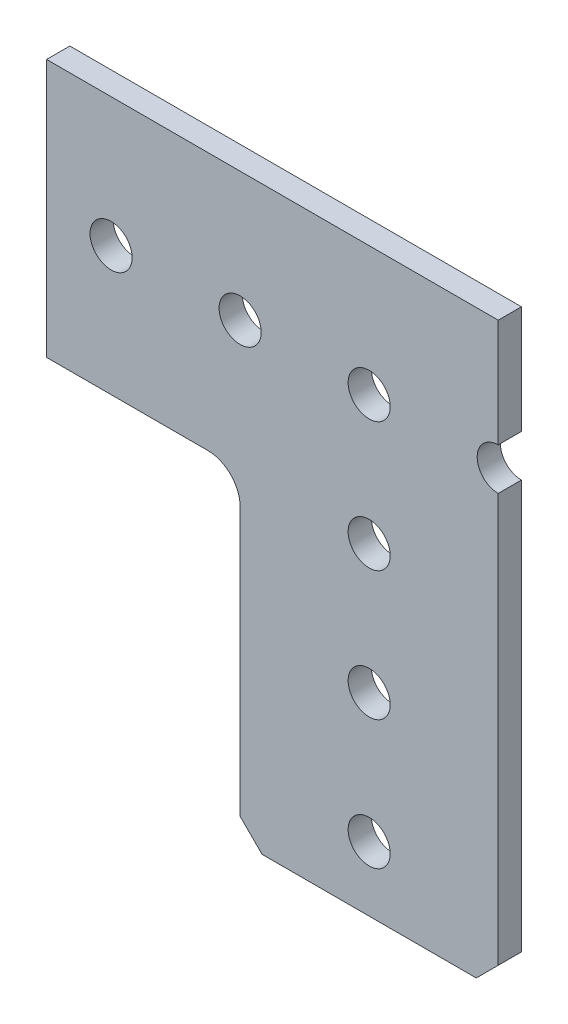
ISO-10303-21;
HEADER;
FILE_DESCRIPTION(('STEP AP214'),'2;1');
FILE_NAME('part.step','',(''),(''),'','','');
FILE_SCHEMA(('AUTOMOTIVE_DESIGN { 1 0 10303 214 1 1 1 1 }'));
ENDSEC;
DATA;
#1=APPLICATION_CONTEXT('core data for automotive mechanical design processes');
#2=APPLICATION_PROTOCOL_DEFINITION('international standard','automotive_design',2000,#1);
#3=PRODUCT_CONTEXT('',#1,'mechanical');
#4=PRODUCT('Part','Part','',(#3));
#5=PRODUCT_RELATED_PRODUCT_CATEGORY('part','',(#4));
#6=PRODUCT_DEFINITION_FORMATION('','',#4);
#7=PRODUCT_DEFINITION_CONTEXT('part definition',#1,'design');
#8=PRODUCT_DEFINITION('design','',#6,#7);
#9=PRODUCT_DEFINITION_SHAPE('','',#8);
#10=(LENGTH_UNIT() NAMED_UNIT(*) SI_UNIT(.MILLI.,.METRE.));
#11=(NAMED_UNIT(*) PLANE_ANGLE_UNIT() SI_UNIT($,.RADIAN.));
#12=(NAMED_UNIT(*) SI_UNIT($,.STERADIAN.) SOLID_ANGLE_UNIT());
#13=UNCERTAINTY_MEASURE_WITH_UNIT(LENGTH_MEASURE(1.E-05),#10,'distance_accuracy_value','');
#14=(GEOMETRIC_REPRESENTATION_CONTEXT(3) GLOBAL_UNCERTAINTY_ASSIGNED_CONTEXT((#13)) GLOBAL_UNIT_ASSIGNED_CONTEXT((#10,
#11,#12)) REPRESENTATION_CONTEXT('',''));
#15=CARTESIAN_POINT('',(0.,0.,0.));
#16=DIRECTION('',(0.,0.,1.));
#17=DIRECTION('',(1.,0.,0.));
#18=AXIS2_PLACEMENT_3D('',#15,#16,#17);
#19=CARTESIAN_POINT('',(-44.45,0.,0.));
#20=DIRECTION('',(0.,0.,1.));
#21=DIRECTION('',(1.,0.,0.));
#22=AXIS2_PLACEMENT_3D('',#19,#20,#21);
#23=PLANE('',#22);
#24=CARTESIAN_POINT('',(0.,-12.7,0.));
#25=DIRECTION('',(0.,0.,-1.));
#26=DIRECTION('',(-1.,0.,0.));
#27=AXIS2_PLACEMENT_3D('',#24,#25,#26);
#28=CIRCLE('',#27,2.0701);
#29=CARTESIAN_POINT('',(-2.0701,-12.7,0.));
#30=VERTEX_POINT('',#29);
#31=EDGE_CURVE('E131',#30,#30,#28,.F.);
#32=ORIENTED_EDGE('',*,*,#31,.T.);
#33=EDGE_LOOP('',(#32));
#34=FACE_BOUND('',#33,.T.);
#35=DIRECTION('',(0.,1.,0.));
#36=VECTOR('',#35,1.);
#37=CARTESIAN_POINT('',(-31.75,25.4,0.));
#38=LINE('',#37,#36);
#39=CARTESIAN_POINT('',(-31.75,0.,0.));
#40=VERTEX_POINT('',#39);
#41=CARTESIAN_POINT('',(-31.75,25.4,0.));
#42=VERTEX_POINT('',#41);
#43=EDGE_CURVE('E112',#40,#42,#38,.T.);
#44=ORIENTED_EDGE('',*,*,#43,.T.);
#45=DIRECTION('',(1.,0.,0.));
#46=VECTOR('',#45,1.);
#47=CARTESIAN_POINT('',(-44.45,25.4,0.));
#48=LINE('',#47,#46);
#49=CARTESIAN_POINT('',(12.7,25.4,0.));
#50=VERTEX_POINT('',#49);
#51=EDGE_CURVE('E137',#42,#50,#48,.T.);
#52=ORIENTED_EDGE('',*,*,#51,.T.);
#53=DIRECTION('',(0.,1.,0.));
#54=VECTOR('',#53,1.);
#55=CARTESIAN_POINT('',(12.7,25.4,0.));
#56=LINE('',#55,#54);
#57=CARTESIAN_POINT('',(12.7,14.7701,0.));
#58=VERTEX_POINT('',#57);
#59=EDGE_CURVE('E148',#50,#58,#56,.F.);
#60=ORIENTED_EDGE('',*,*,#59,.T.);
#61=CARTESIAN_POINT('',(12.7,12.7,0.));
#62=DIRECTION('',(0.,0.,-1.));
#63=DIRECTION('',(-1.,0.,0.));
#64=AXIS2_PLACEMENT_3D('',#61,#62,#63);
#65=CIRCLE('',#64,2.0701);
#66=CARTESIAN_POINT('',(12.7,10.6299,0.));
#67=VERTEX_POINT('',#66);
#68=EDGE_CURVE('E217',#58,#67,#65,.F.);
#69=ORIENTED_EDGE('',*,*,#68,.T.);
#70=DIRECTION('',(0.,-1.,0.));
#71=VECTOR('',#70,1.);
#72=CARTESIAN_POINT('',(12.7,0.,0.));
#73=LINE('',#72,#71);
#74=CARTESIAN_POINT('',(12.7,-29.591,0.));
#75=VERTEX_POINT('',#74);
#76=EDGE_CURVE('E154',#67,#75,#73,.T.);
#77=ORIENTED_EDGE('',*,*,#76,.T.);
#78=DIRECTION('',(-0.707106781186547,-0.707106781186548,0.));
#79=VECTOR('',#78,1.);
#80=CARTESIAN_POINT('',(12.7,-29.591,0.));
#81=LINE('',#80,#79);
#82=CARTESIAN_POINT('',(10.541,-31.75,0.));
#83=VERTEX_POINT('',#82);
#84=EDGE_CURVE('E161',#75,#83,#81,.T.);
#85=ORIENTED_EDGE('',*,*,#84,.T.);
#86=DIRECTION('',(1.,0.,0.));
#87=VECTOR('',#86,1.);
#88=CARTESIAN_POINT('',(-12.7,-31.75,0.));
#89=LINE('',#88,#87);
#90=CARTESIAN_POINT('',(-10.541,-31.75,0.));
#91=VERTEX_POINT('',#90);
#92=EDGE_CURVE('E164',#83,#91,#89,.F.);
#93=ORIENTED_EDGE('',*,*,#92,.T.);
#94=DIRECTION('',(-0.707106781186547,0.707106781186548,0.));
#95=VECTOR('',#94,1.);
#96=CARTESIAN_POINT('',(-10.541,-31.75,0.));
#97=LINE('',#96,#95);
#98=CARTESIAN_POINT('',(-12.7,-29.591,0.));
#99=VERTEX_POINT('',#98);
#100=EDGE_CURVE('E172',#91,#99,#97,.T.);
#101=ORIENTED_EDGE('',*,*,#100,.T.);
#102=DIRECTION('',(0.,1.,0.));
#103=VECTOR('',#102,1.);
#104=CARTESIAN_POINT('',(-12.7,0.,0.));
#105=LINE('',#104,#103);
#106=CARTESIAN_POINT('',(-12.7,-3.175,0.));
#107=VERTEX_POINT('',#106);
#108=EDGE_CURVE('E96',#99,#107,#105,.T.);
#109=ORIENTED_EDGE('',*,*,#108,.T.);
#110=CARTESIAN_POINT('',(-15.875,-3.175,0.));
#111=DIRECTION('',(0.,0.,1.));
#112=DIRECTION('',(1.,0.,0.));
#113=AXIS2_PLACEMENT_3D('',#110,#111,#112);
#114=CIRCLE('',#113,3.175);
#115=CARTESIAN_POINT('',(-15.875,0.,0.));
#116=VERTEX_POINT('',#115);
#117=EDGE_CURVE('E20',#107,#116,#114,.T.);
#118=ORIENTED_EDGE('',*,*,#117,.T.);
#119=DIRECTION('',(1.,0.,0.));
#120=VECTOR('',#119,1.);
#121=CARTESIAN_POINT('',(-44.45,0.,0.));
#122=LINE('',#121,#120);
#123=EDGE_CURVE('E100',#116,#40,#122,.F.);
#124=ORIENTED_EDGE('',*,*,#123,.T.);
#125=EDGE_LOOP('',(#44,#52,#60,#69,#77,#85,#93,#101,#109,#118,#124));
#126=FACE_BOUND('',#125,.T.);
#127=CARTESIAN_POINT('',(-12.7,12.7,0.));
#128=DIRECTION('',(0.,0.,-1.));
#129=DIRECTION('',(-1.,0.,0.));
#130=AXIS2_PLACEMENT_3D('',#127,#128,#129);
#131=CIRCLE('',#130,2.0701);
#132=CARTESIAN_POINT('',(-14.7701,12.7,0.));
#133=VERTEX_POINT('',#132);
#134=EDGE_CURVE('E204',#133,#133,#131,.F.);
#135=ORIENTED_EDGE('',*,*,#134,.T.);
#136=EDGE_LOOP('',(#135));
#137=FACE_BOUND('',#136,.T.);
#138=CARTESIAN_POINT('',(-25.4,12.7,0.));
#139=DIRECTION('',(0.,0.,-1.));
#140=DIRECTION('',(-1.,0.,0.));
#141=AXIS2_PLACEMENT_3D('',#138,#139,#140);
#142=CIRCLE('',#141,2.0701);
#143=CARTESIAN_POINT('',(-27.4701,12.7,0.));
#144=VERTEX_POINT('',#143);
#145=EDGE_CURVE('E207',#144,#144,#142,.F.);
#146=ORIENTED_EDGE('',*,*,#145,.T.);
#147=EDGE_LOOP('',(#146));
#148=FACE_BOUND('',#147,.T.);
#149=CARTESIAN_POINT('',(0.,-25.4,0.));
#150=DIRECTION('',(0.,0.,-1.));
#151=DIRECTION('',(-1.,0.,0.));
#152=AXIS2_PLACEMENT_3D('',#149,#150,#151);
#153=CIRCLE('',#152,2.0701);
#154=CARTESIAN_POINT('',(-2.0701,-25.4,0.));
#155=VERTEX_POINT('',#154);
#156=EDGE_CURVE('E210',#155,#155,#153,.F.);
#157=ORIENTED_EDGE('',*,*,#156,.T.);
#158=EDGE_LOOP('',(#157));
#159=FACE_BOUND('',#158,.T.);
#160=CARTESIAN_POINT('',(0.,12.7,0.));
#161=DIRECTION('',(0.,0.,-1.));
#162=DIRECTION('',(-1.,0.,0.));
#163=AXIS2_PLACEMENT_3D('',#160,#161,#162);
#164=CIRCLE('',#163,2.0701);
#165=CARTESIAN_POINT('',(-2.0701,12.7,0.));
#166=VERTEX_POINT('',#165);
#167=EDGE_CURVE('E213',#166,#166,#164,.F.);
#168=ORIENTED_EDGE('',*,*,#167,.T.);
#169=EDGE_LOOP('',(#168));
#170=FACE_BOUND('',#169,.T.);
#171=CARTESIAN_POINT('',(0.,0.,0.));
#172=DIRECTION('',(0.,0.,-1.));
#173=DIRECTION('',(-1.,0.,0.));
#174=AXIS2_PLACEMENT_3D('',#171,#172,#173);
#175=CIRCLE('',#174,2.0701);
#176=CARTESIAN_POINT('',(-2.0701,0.,0.));
#177=VERTEX_POINT('',#176);
#178=EDGE_CURVE('E145',#177,#177,#175,.F.);
#179=ORIENTED_EDGE('',*,*,#178,.T.);
#180=EDGE_LOOP('',(#179));
#181=FACE_BOUND('',#180,.T.);
#182=ADVANCED_FACE('F17',(#34,#126,#137,#148,#159,#170,#181),#23,.F.);
#183=CARTESIAN_POINT('',(-31.75,25.4,0.));
#184=DIRECTION('',(1.,0.,0.));
#185=DIRECTION('',(0.,0.,-1.));
#186=AXIS2_PLACEMENT_3D('',#183,#184,#185);
#187=PLANE('',#186);
#188=DIRECTION('',(0.,0.,-1.));
#189=VECTOR('',#188,1.);
#190=CARTESIAN_POINT('',(-31.75,25.4,2.286));
#191=LINE('',#190,#189);
#192=CARTESIAN_POINT('',(-31.75,25.4,2.286));
#193=VERTEX_POINT('',#192);
#194=EDGE_CURVE('E134',#193,#42,#191,.T.);
#195=ORIENTED_EDGE('',*,*,#194,.T.);
#196=ORIENTED_EDGE('',*,*,#43,.F.);
#197=DIRECTION('',(0.,0.,1.));
#198=VECTOR('',#197,1.);
#199=CARTESIAN_POINT('',(-31.75,0.,2.286));
#200=LINE('',#199,#198);
#201=CARTESIAN_POINT('',(-31.75,0.,2.286));
#202=VERTEX_POINT('',#201);
#203=EDGE_CURVE('E106',#40,#202,#200,.T.);
#204=ORIENTED_EDGE('',*,*,#203,.T.);
#205=DIRECTION('',(0.,1.,0.));
#206=VECTOR('',#205,1.);
#207=CARTESIAN_POINT('',(-31.75,0.,2.286));
#208=LINE('',#207,#206);
#209=EDGE_CURVE('E127',#193,#202,#208,.F.);
#210=ORIENTED_EDGE('',*,*,#209,.F.);
#211=EDGE_LOOP('',(#195,#196,#204,#210));
#212=FACE_BOUND('',#211,.T.);
#213=ADVANCED_FACE('F452',(#212),#187,.F.);
#214=CARTESIAN_POINT('',(-44.45,0.,2.286));
#215=DIRECTION('',(0.,1.,0.));
#216=DIRECTION('',(0.,0.,1.));
#217=AXIS2_PLACEMENT_3D('',#214,#215,#216);
#218=PLANE('',#217);
#219=ORIENTED_EDGE('',*,*,#203,.F.);
#220=ORIENTED_EDGE('',*,*,#123,.F.);
#221=DIRECTION('',(0.,0.,1.));
#222=VECTOR('',#221,1.);
#223=CARTESIAN_POINT('',(-15.875,0.,2.286));
#224=LINE('',#223,#222);
#225=CARTESIAN_POINT('',(-15.875,0.,2.286));
#226=VERTEX_POINT('',#225);
#227=EDGE_CURVE('E105',#116,#226,#224,.T.);
#228=ORIENTED_EDGE('',*,*,#227,.T.);
#229=DIRECTION('',(1.,0.,0.));
#230=VECTOR('',#229,1.);
#231=CARTESIAN_POINT('',(-44.45,0.,2.286));
#232=LINE('',#231,#230);
#233=EDGE_CURVE('E130',#202,#226,#232,.T.);
#234=ORIENTED_EDGE('',*,*,#233,.F.);
#235=EDGE_LOOP('',(#219,#220,#228,#234));
#236=FACE_BOUND('',#235,.T.);
#237=ADVANCED_FACE('F109',(#236),#218,.F.);
#238=CARTESIAN_POINT('',(-15.875,-3.175,2.286));
#239=DIRECTION('',(0.,0.,1.));
#240=DIRECTION('',(1.,0.,0.));
#241=AXIS2_PLACEMENT_3D('',#238,#239,#240);
#242=CYLINDRICAL_SURFACE('',#241,3.175);
#243=ORIENTED_EDGE('',*,*,#227,.F.);
#244=ORIENTED_EDGE('',*,*,#117,.F.);
#245=DIRECTION('',(0.,0.,-1.));
#246=VECTOR('',#245,1.);
#247=CARTESIAN_POINT('',(-12.7,-3.175,2.286));
#248=LINE('',#247,#246);
#249=CARTESIAN_POINT('',(-12.7,-3.175,2.286));
#250=VERTEX_POINT('',#249);
#251=EDGE_CURVE('E119',#107,#250,#248,.F.);
#252=ORIENTED_EDGE('',*,*,#251,.T.);
#253=CARTESIAN_POINT('',(-15.875,-3.175,2.286));
#254=DIRECTION('',(0.,0.,1.));
#255=DIRECTION('',(1.,0.,0.));
#256=AXIS2_PLACEMENT_3D('',#253,#254,#255);
#257=CIRCLE('',#256,3.175);
#258=EDGE_CURVE('E116',#226,#250,#257,.F.);
#259=ORIENTED_EDGE('',*,*,#258,.F.);
#260=EDGE_LOOP('',(#243,#244,#252,#259));
#261=FACE_BOUND('',#260,.T.);
#262=ADVANCED_FACE('F114',(#261),#242,.F.);
#263=CARTESIAN_POINT('',(-12.7,0.,2.286));
#264=DIRECTION('',(1.,0.,0.));
#265=DIRECTION('',(0.,0.,-1.));
#266=AXIS2_PLACEMENT_3D('',#263,#264,#265);
#267=PLANE('',#266);
#268=ORIENTED_EDGE('',*,*,#251,.F.);
#269=ORIENTED_EDGE('',*,*,#108,.F.);
#270=DIRECTION('',(0.,0.,1.));
#271=VECTOR('',#270,1.);
#272=CARTESIAN_POINT('',(-12.7,-29.591,2.286));
#273=LINE('',#272,#271);
#274=CARTESIAN_POINT('',(-12.7,-29.591,2.286));
#275=VERTEX_POINT('',#274);
#276=EDGE_CURVE('E174',#99,#275,#273,.T.);
#277=ORIENTED_EDGE('',*,*,#276,.T.);
#278=DIRECTION('',(0.,1.,0.));
#279=VECTOR('',#278,1.);
#280=CARTESIAN_POINT('',(-12.7,0.,2.286));
#281=LINE('',#280,#279);
#282=EDGE_CURVE('E201',#250,#275,#281,.F.);
#283=ORIENTED_EDGE('',*,*,#282,.F.);
#284=EDGE_LOOP('',(#268,#269,#277,#283));
#285=FACE_BOUND('',#284,.T.);
#286=ADVANCED_FACE('F259',(#285),#267,.F.);
#287=CARTESIAN_POINT('',(-10.541,-31.75,2.286));
#288=DIRECTION('',(0.707106781186548,0.707106781186547,0.));
#289=DIRECTION('',(-0.707106781186547,0.707106781186548,0.));
#290=AXIS2_PLACEMENT_3D('',#287,#288,#289);
#291=PLANE('',#290);
#292=ORIENTED_EDGE('',*,*,#276,.F.);
#293=ORIENTED_EDGE('',*,*,#100,.F.);
#294=DIRECTION('',(0.,0.,1.));
#295=VECTOR('',#294,1.);
#296=CARTESIAN_POINT('',(-10.541,-31.75,2.286));
#297=LINE('',#296,#295);
#298=CARTESIAN_POINT('',(-10.541,-31.75,2.286));
#299=VERTEX_POINT('',#298);
#300=EDGE_CURVE('E169',#91,#299,#297,.T.);
#301=ORIENTED_EDGE('',*,*,#300,.T.);
#302=DIRECTION('',(0.707106781186547,-0.707106781186547,0.));
#303=VECTOR('',#302,1.);
#304=CARTESIAN_POINT('',(-12.7,-29.591,2.286));
#305=LINE('',#304,#303);
#306=EDGE_CURVE('E244',#275,#299,#305,.T.);
#307=ORIENTED_EDGE('',*,*,#306,.F.);
#308=EDGE_LOOP('',(#292,#293,#301,#307));
#309=FACE_BOUND('',#308,.T.);
#310=ADVANCED_FACE('F262',(#309),#291,.F.);
#311=CARTESIAN_POINT('',(-12.7,-31.75,2.286));
#312=DIRECTION('',(0.,1.,0.));
#313=DIRECTION('',(0.,0.,1.));
#314=AXIS2_PLACEMENT_3D('',#311,#312,#313);
#315=PLANE('',#314);
#316=DIRECTION('',(0.,0.,1.));
#317=VECTOR('',#316,1.);
#318=CARTESIAN_POINT('',(10.541,-31.75,2.286));
#319=LINE('',#318,#317);
#320=CARTESIAN_POINT('',(10.541,-31.75,2.286));
#321=VERTEX_POINT('',#320);
#322=EDGE_CURVE('E163',#83,#321,#319,.T.);
#323=ORIENTED_EDGE('',*,*,#322,.T.);
#324=DIRECTION('',(1.,0.,0.));
#325=VECTOR('',#324,1.);
#326=CARTESIAN_POINT('',(-44.45,-31.75,2.286));
#327=LINE('',#326,#325);
#328=EDGE_CURVE('E236',#299,#321,#327,.T.);
#329=ORIENTED_EDGE('',*,*,#328,.F.);
#330=ORIENTED_EDGE('',*,*,#300,.F.);
#331=ORIENTED_EDGE('',*,*,#92,.F.);
#332=EDGE_LOOP('',(#323,#329,#330,#331));
#333=FACE_BOUND('',#332,.T.);
#334=ADVANCED_FACE('F293',(#333),#315,.F.);
#335=CARTESIAN_POINT('',(12.7,-29.591,2.286));
#336=DIRECTION('',(-0.707106781186548,0.707106781186547,0.));
#337=DIRECTION('',(-0.707106781186547,-0.707106781186548,0.));
#338=AXIS2_PLACEMENT_3D('',#335,#336,#337);
#339=PLANE('',#338);
#340=ORIENTED_EDGE('',*,*,#322,.F.);
#341=ORIENTED_EDGE('',*,*,#84,.F.);
#342=DIRECTION('',(0.,0.,1.));
#343=VECTOR('',#342,1.);
#344=CARTESIAN_POINT('',(12.7,-29.591,2.286));
#345=LINE('',#344,#343);
#346=CARTESIAN_POINT('',(12.7,-29.591,2.286));
#347=VERTEX_POINT('',#346);
#348=EDGE_CURVE('E158',#75,#347,#345,.T.);
#349=ORIENTED_EDGE('',*,*,#348,.T.);
#350=DIRECTION('',(0.707106781186547,0.707106781186547,0.));
#351=VECTOR('',#350,1.);
#352=CARTESIAN_POINT('',(10.541,-31.75,2.286));
#353=LINE('',#352,#351);
#354=EDGE_CURVE('E233',#321,#347,#353,.T.);
#355=ORIENTED_EDGE('',*,*,#354,.F.);
#356=EDGE_LOOP('',(#340,#341,#349,#355));
#357=FACE_BOUND('',#356,.T.);
#358=ADVANCED_FACE('F290',(#357),#339,.F.);
#359=CARTESIAN_POINT('',(12.7,0.,2.286));
#360=DIRECTION('',(-1.,0.,0.));
#361=DIRECTION('',(0.,-1.,0.));
#362=AXIS2_PLACEMENT_3D('',#359,#360,#361);
#363=PLANE('',#362);
#364=DIRECTION('',(0.,0.,-1.));
#365=VECTOR('',#364,1.);
#366=CARTESIAN_POINT('',(12.7,10.6299,2.286));
#367=LINE('',#366,#365);
#368=CARTESIAN_POINT('',(12.7,10.6299,2.286));
#369=VERTEX_POINT('',#368);
#370=EDGE_CURVE('E157',#67,#369,#367,.F.);
#371=ORIENTED_EDGE('',*,*,#370,.T.);
#372=DIRECTION('',(0.,1.,0.));
#373=VECTOR('',#372,1.);
#374=CARTESIAN_POINT('',(12.7,0.,2.286));
#375=LINE('',#374,#373);
#376=EDGE_CURVE('E199',#347,#369,#375,.T.);
#377=ORIENTED_EDGE('',*,*,#376,.F.);
#378=ORIENTED_EDGE('',*,*,#348,.F.);
#379=ORIENTED_EDGE('',*,*,#76,.F.);
#380=EDGE_LOOP('',(#371,#377,#378,#379));
#381=FACE_BOUND('',#380,.T.);
#382=ADVANCED_FACE('F287',(#381),#363,.F.);
#383=CARTESIAN_POINT('',(12.7,12.7,2.286));
#384=DIRECTION('',(0.,0.,-1.));
#385=DIRECTION('',(-1.,0.,0.));
#386=AXIS2_PLACEMENT_3D('',#383,#384,#385);
#387=CYLINDRICAL_SURFACE('',#386,2.0701);
#388=DIRECTION('',(0.,0.,1.));
#389=VECTOR('',#388,1.);
#390=CARTESIAN_POINT('',(12.7,14.7701,0.));
#391=LINE('',#390,#389);
#392=CARTESIAN_POINT('',(12.7,14.7701,2.286));
#393=VERTEX_POINT('',#392);
#394=EDGE_CURVE('E151',#58,#393,#391,.T.);
#395=ORIENTED_EDGE('',*,*,#394,.T.);
#396=CARTESIAN_POINT('',(12.7,12.7,2.286));
#397=DIRECTION('',(0.,0.,-1.));
#398=DIRECTION('',(-1.,0.,0.));
#399=AXIS2_PLACEMENT_3D('',#396,#397,#398);
#400=CIRCLE('',#399,2.0701);
#401=EDGE_CURVE('E196',#369,#393,#400,.T.);
#402=ORIENTED_EDGE('',*,*,#401,.F.);
#403=ORIENTED_EDGE('',*,*,#370,.F.);
#404=ORIENTED_EDGE('',*,*,#68,.F.);
#405=EDGE_LOOP('',(#395,#402,#403,#404));
#406=FACE_BOUND('',#405,.T.);
#407=ADVANCED_FACE('F341',(#406),#387,.F.);
#408=CARTESIAN_POINT('',(12.7,25.4,0.));
#409=DIRECTION('',(-1.,0.,0.));
#410=DIRECTION('',(0.,0.,1.));
#411=AXIS2_PLACEMENT_3D('',#408,#409,#410);
#412=PLANE('',#411);
#413=DIRECTION('',(0.,0.,-1.));
#414=VECTOR('',#413,1.);
#415=CARTESIAN_POINT('',(12.7,25.4,2.286));
#416=LINE('',#415,#414);
#417=CARTESIAN_POINT('',(12.7,25.4,2.286));
#418=VERTEX_POINT('',#417);
#419=EDGE_CURVE('E35',#50,#418,#416,.F.);
#420=ORIENTED_EDGE('',*,*,#419,.T.);
#421=DIRECTION('',(0.,1.,0.));
#422=VECTOR('',#421,1.);
#423=CARTESIAN_POINT('',(12.7,0.,2.286));
#424=LINE('',#423,#422);
#425=EDGE_CURVE('E198',#393,#418,#424,.T.);
#426=ORIENTED_EDGE('',*,*,#425,.F.);
#427=ORIENTED_EDGE('',*,*,#394,.F.);
#428=ORIENTED_EDGE('',*,*,#59,.F.);
#429=EDGE_LOOP('',(#420,#426,#427,#428));
#430=FACE_BOUND('',#429,.T.);
#431=ADVANCED_FACE('F337',(#430),#412,.F.);
#432=CARTESIAN_POINT('',(-44.45,25.4,2.286));
#433=DIRECTION('',(0.,-1.,0.));
#434=DIRECTION('',(0.,0.,-1.));
#435=AXIS2_PLACEMENT_3D('',#432,#433,#434);
#436=PLANE('',#435);
#437=ORIENTED_EDGE('',*,*,#194,.F.);
#438=DIRECTION('',(1.,0.,0.));
#439=VECTOR('',#438,1.);
#440=CARTESIAN_POINT('',(-44.45,25.4,2.286));
#441=LINE('',#440,#439);
#442=EDGE_CURVE('E195',#418,#193,#441,.F.);
#443=ORIENTED_EDGE('',*,*,#442,.F.);
#444=ORIENTED_EDGE('',*,*,#419,.F.);
#445=ORIENTED_EDGE('',*,*,#51,.F.);
#446=EDGE_LOOP('',(#437,#443,#444,#445));
#447=FACE_BOUND('',#446,.T.);
#448=ADVANCED_FACE('F333',(#447),#436,.F.);
#449=CARTESIAN_POINT('',(0.,0.,2.286));
#450=DIRECTION('',(0.,0.,-1.));
#451=DIRECTION('',(-1.,0.,0.));
#452=AXIS2_PLACEMENT_3D('',#449,#450,#451);
#453=CYLINDRICAL_SURFACE('',#452,2.0701);
#454=CARTESIAN_POINT('',(0.,0.,2.286));
#455=DIRECTION('',(0.,0.,-1.));
#456=DIRECTION('',(-1.,0.,0.));
#457=AXIS2_PLACEMENT_3D('',#454,#455,#456);
#458=CIRCLE('',#457,2.0701);
#459=CARTESIAN_POINT('',(-2.0701,0.,2.286));
#460=VERTEX_POINT('',#459);
#461=EDGE_CURVE('E192',#460,#460,#458,.T.);
#462=ORIENTED_EDGE('',*,*,#461,.F.);
#463=EDGE_LOOP('',(#462));
#464=FACE_BOUND('',#463,.T.);
#465=ORIENTED_EDGE('',*,*,#178,.F.);
#466=EDGE_LOOP('',(#465));
#467=FACE_BOUND('',#466,.T.);
#468=ADVANCED_FACE('F329',(#464,#467),#453,.F.);
#469=CARTESIAN_POINT('',(0.,12.7,2.286));
#470=DIRECTION('',(0.,0.,-1.));
#471=DIRECTION('',(-1.,0.,0.));
#472=AXIS2_PLACEMENT_3D('',#469,#470,#471);
#473=CYLINDRICAL_SURFACE('',#472,2.0701);
#474=CARTESIAN_POINT('',(0.,12.7,2.286));
#475=DIRECTION('',(0.,0.,-1.));
#476=DIRECTION('',(-1.,0.,0.));
#477=AXIS2_PLACEMENT_3D('',#474,#475,#476);
#478=CIRCLE('',#477,2.0701);
#479=CARTESIAN_POINT('',(-2.0701,12.7,2.286));
#480=VERTEX_POINT('',#479);
#481=EDGE_CURVE('E189',#480,#480,#478,.T.);
#482=ORIENTED_EDGE('',*,*,#481,.F.);
#483=EDGE_LOOP('',(#482));
#484=FACE_BOUND('',#483,.T.);
#485=ORIENTED_EDGE('',*,*,#167,.F.);
#486=EDGE_LOOP('',(#485));
#487=FACE_BOUND('',#486,.T.);
#488=ADVANCED_FACE('F325',(#484,#487),#473,.F.);
#489=CARTESIAN_POINT('',(0.,-25.4,2.286));
#490=DIRECTION('',(0.,0.,-1.));
#491=DIRECTION('',(-1.,0.,0.));
#492=AXIS2_PLACEMENT_3D('',#489,#490,#491);
#493=CYLINDRICAL_SURFACE('',#492,2.0701);
#494=CARTESIAN_POINT('',(0.,-25.4,2.286));
#495=DIRECTION('',(0.,0.,-1.));
#496=DIRECTION('',(-1.,0.,0.));
#497=AXIS2_PLACEMENT_3D('',#494,#495,#496);
#498=CIRCLE('',#497,2.0701);
#499=CARTESIAN_POINT('',(-2.0701,-25.4,2.286));
#500=VERTEX_POINT('',#499);
#501=EDGE_CURVE('E186',#500,#500,#498,.T.);
#502=ORIENTED_EDGE('',*,*,#501,.F.);
#503=EDGE_LOOP('',(#502));
#504=FACE_BOUND('',#503,.T.);
#505=ORIENTED_EDGE('',*,*,#156,.F.);
#506=EDGE_LOOP('',(#505));
#507=FACE_BOUND('',#506,.T.);
#508=ADVANCED_FACE('F321',(#504,#507),#493,.F.);
#509=CARTESIAN_POINT('',(-25.4,12.7,2.286));
#510=DIRECTION('',(0.,0.,-1.));
#511=DIRECTION('',(-1.,0.,0.));
#512=AXIS2_PLACEMENT_3D('',#509,#510,#511);
#513=CYLINDRICAL_SURFACE('',#512,2.0701);
#514=CARTESIAN_POINT('',(-25.4,12.7,2.286));
#515=DIRECTION('',(0.,0.,-1.));
#516=DIRECTION('',(-1.,0.,0.));
#517=AXIS2_PLACEMENT_3D('',#514,#515,#516);
#518=CIRCLE('',#517,2.0701);
#519=CARTESIAN_POINT('',(-27.4701,12.7,2.286));
#520=VERTEX_POINT('',#519);
#521=EDGE_CURVE('E183',#520,#520,#518,.T.);
#522=ORIENTED_EDGE('',*,*,#521,.F.);
#523=EDGE_LOOP('',(#522));
#524=FACE_BOUND('',#523,.T.);
#525=ORIENTED_EDGE('',*,*,#145,.F.);
#526=EDGE_LOOP('',(#525));
#527=FACE_BOUND('',#526,.T.);
#528=ADVANCED_FACE('F317',(#524,#527),#513,.F.);
#529=CARTESIAN_POINT('',(-12.7,12.7,2.286));
#530=DIRECTION('',(0.,0.,-1.));
#531=DIRECTION('',(-1.,0.,0.));
#532=AXIS2_PLACEMENT_3D('',#529,#530,#531);
#533=CYLINDRICAL_SURFACE('',#532,2.0701);
#534=CARTESIAN_POINT('',(-12.7,12.7,2.286));
#535=DIRECTION('',(0.,0.,-1.));
#536=DIRECTION('',(-1.,0.,0.));
#537=AXIS2_PLACEMENT_3D('',#534,#535,#536);
#538=CIRCLE('',#537,2.0701);
#539=CARTESIAN_POINT('',(-14.7701,12.7,2.286));
#540=VERTEX_POINT('',#539);
#541=EDGE_CURVE('E26',#540,#540,#538,.T.);
#542=ORIENTED_EDGE('',*,*,#541,.F.);
#543=EDGE_LOOP('',(#542));
#544=FACE_BOUND('',#543,.T.);
#545=ORIENTED_EDGE('',*,*,#134,.F.);
#546=EDGE_LOOP('',(#545));
#547=FACE_BOUND('',#546,.T.);
#548=ADVANCED_FACE('F310',(#544,#547),#533,.F.);
#549=CARTESIAN_POINT('',(0.,-12.7,2.286));
#550=DIRECTION('',(0.,0.,-1.));
#551=DIRECTION('',(-1.,0.,0.));
#552=AXIS2_PLACEMENT_3D('',#549,#550,#551);
#553=CYLINDRICAL_SURFACE('',#552,2.0701);
#554=CARTESIAN_POINT('',(0.,-12.7,2.286));
#555=DIRECTION('',(0.,0.,-1.));
#556=DIRECTION('',(-1.,0.,0.));
#557=AXIS2_PLACEMENT_3D('',#554,#555,#556);
#558=CIRCLE('',#557,2.0701);
#559=CARTESIAN_POINT('',(-2.0701,-12.7,2.286));
#560=VERTEX_POINT('',#559);
#561=EDGE_CURVE('E11',#560,#560,#558,.T.);
#562=ORIENTED_EDGE('',*,*,#561,.F.);
#563=EDGE_LOOP('',(#562));
#564=FACE_BOUND('',#563,.T.);
#565=ORIENTED_EDGE('',*,*,#31,.F.);
#566=EDGE_LOOP('',(#565));
#567=FACE_BOUND('',#566,.T.);
#568=ADVANCED_FACE('F304',(#564,#567),#553,.F.);
#569=CARTESIAN_POINT('',(-44.45,0.,2.286));
#570=DIRECTION('',(0.,0.,1.));
#571=DIRECTION('',(1.,0.,0.));
#572=AXIS2_PLACEMENT_3D('',#569,#570,#571);
#573=PLANE('',#572);
#574=ORIENTED_EDGE('',*,*,#561,.T.);
#575=EDGE_LOOP('',(#574));
#576=FACE_BOUND('',#575,.T.);
#577=ORIENTED_EDGE('',*,*,#541,.T.);
#578=EDGE_LOOP('',(#577));
#579=FACE_BOUND('',#578,.T.);
#580=ORIENTED_EDGE('',*,*,#521,.T.);
#581=EDGE_LOOP('',(#580));
#582=FACE_BOUND('',#581,.T.);
#583=ORIENTED_EDGE('',*,*,#501,.T.);
#584=EDGE_LOOP('',(#583));
#585=FACE_BOUND('',#584,.T.);
#586=ORIENTED_EDGE('',*,*,#481,.T.);
#587=EDGE_LOOP('',(#586));
#588=FACE_BOUND('',#587,.T.);
#589=ORIENTED_EDGE('',*,*,#461,.T.);
#590=EDGE_LOOP('',(#589));
#591=FACE_BOUND('',#590,.T.);
#592=ORIENTED_EDGE('',*,*,#425,.T.);
#593=ORIENTED_EDGE('',*,*,#442,.T.);
#594=ORIENTED_EDGE('',*,*,#209,.T.);
#595=ORIENTED_EDGE('',*,*,#233,.T.);
#596=ORIENTED_EDGE('',*,*,#258,.T.);
#597=ORIENTED_EDGE('',*,*,#282,.T.);
#598=ORIENTED_EDGE('',*,*,#306,.T.);
#599=ORIENTED_EDGE('',*,*,#328,.T.);
#600=ORIENTED_EDGE('',*,*,#354,.T.);
#601=ORIENTED_EDGE('',*,*,#376,.T.);
#602=ORIENTED_EDGE('',*,*,#401,.T.);
#603=EDGE_LOOP('',(#592,#593,#594,#595,#596,#597,#598,#599,#600,#601,#602));
#604=FACE_BOUND('',#603,.T.);
#605=ADVANCED_FACE('F267',(#576,#579,#582,#585,#588,#591,#604),#573,.T.);
#606=CLOSED_SHELL('',(#182,#213,#237,#262,#286,#310,#334,#358,#382,#407,#431,#448,#468,#488,
#508,#528,#548,#568,#605));
#607=MANIFOLD_SOLID_BREP('B1',#606);
#608=ADVANCED_BREP_SHAPE_REPRESENTATION('',(#18,#607),#14);
#609=SHAPE_DEFINITION_REPRESENTATION(#9,#608);
ENDSEC;
END-ISO-10303-21;
